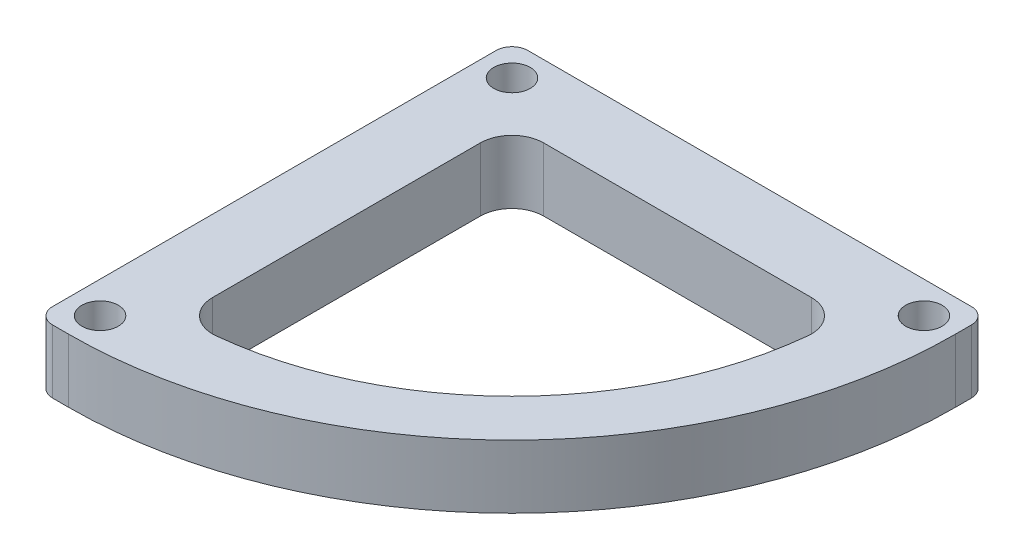
ISO-10303-21;
HEADER;
FILE_DESCRIPTION(('STEP AP214'),'2;1');
FILE_NAME('part.step','',(''),(''),'','','');
FILE_SCHEMA(('AUTOMOTIVE_DESIGN { 1 0 10303 214 1 1 1 1 }'));
ENDSEC;
DATA;
#1=APPLICATION_CONTEXT('core data for automotive mechanical design processes');
#2=APPLICATION_PROTOCOL_DEFINITION('international standard','automotive_design',2000,#1);
#3=PRODUCT_CONTEXT('',#1,'mechanical');
#4=PRODUCT('Part','Part','',(#3));
#5=PRODUCT_RELATED_PRODUCT_CATEGORY('part','',(#4));
#6=PRODUCT_DEFINITION_FORMATION('','',#4);
#7=PRODUCT_DEFINITION_CONTEXT('part definition',#1,'design');
#8=PRODUCT_DEFINITION('design','',#6,#7);
#9=PRODUCT_DEFINITION_SHAPE('','',#8);
#10=(LENGTH_UNIT() NAMED_UNIT(*) SI_UNIT(.MILLI.,.METRE.));
#11=(NAMED_UNIT(*) PLANE_ANGLE_UNIT() SI_UNIT($,.RADIAN.));
#12=(NAMED_UNIT(*) SI_UNIT($,.STERADIAN.) SOLID_ANGLE_UNIT());
#13=UNCERTAINTY_MEASURE_WITH_UNIT(LENGTH_MEASURE(1.E-05),#10,'distance_accuracy_value','');
#14=(GEOMETRIC_REPRESENTATION_CONTEXT(3) GLOBAL_UNCERTAINTY_ASSIGNED_CONTEXT((#13)) GLOBAL_UNIT_ASSIGNED_CONTEXT((#10,
#11,#12)) REPRESENTATION_CONTEXT('',''));
#15=CARTESIAN_POINT('',(0.,0.,0.));
#16=DIRECTION('',(0.,0.,1.));
#17=DIRECTION('',(1.,0.,0.));
#18=AXIS2_PLACEMENT_3D('',#15,#16,#17);
#19=CARTESIAN_POINT('',(0.,4.,0.));
#20=DIRECTION('',(0.,1.,0.));
#21=DIRECTION('',(0.,0.,1.));
#22=AXIS2_PLACEMENT_3D('',#19,#20,#21);
#23=PLANE('',#22);
#24=CARTESIAN_POINT('',(-13.,4.,13.));
#25=DIRECTION('',(0.,1.,0.));
#26=DIRECTION('',(0.,0.,1.));
#27=AXIS2_PLACEMENT_3D('',#24,#25,#26);
#28=CIRCLE('',#27,1.15);
#29=CARTESIAN_POINT('',(-13.,4.,14.15));
#30=VERTEX_POINT('',#29);
#31=EDGE_CURVE('E197',#30,#30,#28,.T.);
#32=ORIENTED_EDGE('',*,*,#31,.F.);
#33=EDGE_LOOP('',(#32));
#34=FACE_BOUND('',#33,.T.);
#35=CARTESIAN_POINT('',(13.,4.,-13.));
#36=DIRECTION('',(0.,1.,0.));
#37=DIRECTION('',(0.,0.,1.));
#38=AXIS2_PLACEMENT_3D('',#35,#36,#37);
#39=CIRCLE('',#38,1.15);
#40=CARTESIAN_POINT('',(13.,4.,-11.85));
#41=VERTEX_POINT('',#40);
#42=EDGE_CURVE('E203',#41,#41,#39,.T.);
#43=ORIENTED_EDGE('',*,*,#42,.F.);
#44=EDGE_LOOP('',(#43));
#45=FACE_BOUND('',#44,.T.);
#46=DIRECTION('',(-1.,0.,0.));
#47=VECTOR('',#46,1.);
#48=CARTESIAN_POINT('',(-15.,4.,-15.));
#49=LINE('',#48,#47);
#50=CARTESIAN_POINT('',(14.,4.,-15.));
#51=VERTEX_POINT('',#50);
#52=CARTESIAN_POINT('',(-14.,4.,-15.));
#53=VERTEX_POINT('',#52);
#54=EDGE_CURVE('E212',#51,#53,#49,.T.);
#55=ORIENTED_EDGE('',*,*,#54,.T.);
#56=CARTESIAN_POINT('',(-14.,4.,-14.));
#57=DIRECTION('',(0.,1.,0.));
#58=DIRECTION('',(0.,0.,1.));
#59=AXIS2_PLACEMENT_3D('',#56,#57,#58);
#60=CIRCLE('',#59,1.);
#61=CARTESIAN_POINT('',(-15.,4.,-14.));
#62=VERTEX_POINT('',#61);
#63=EDGE_CURVE('E261',#53,#62,#60,.T.);
#64=ORIENTED_EDGE('',*,*,#63,.T.);
#65=DIRECTION('',(0.,0.,1.));
#66=VECTOR('',#65,1.);
#67=CARTESIAN_POINT('',(-15.,4.,-15.));
#68=LINE('',#67,#66);
#69=CARTESIAN_POINT('',(-15.,4.,14.));
#70=VERTEX_POINT('',#69);
#71=EDGE_CURVE('E216',#62,#70,#68,.T.);
#72=ORIENTED_EDGE('',*,*,#71,.T.);
#73=CARTESIAN_POINT('',(-14.,4.,14.));
#74=DIRECTION('',(0.,1.,0.));
#75=DIRECTION('',(0.,0.,1.));
#76=AXIS2_PLACEMENT_3D('',#73,#74,#75);
#77=CIRCLE('',#76,1.);
#78=CARTESIAN_POINT('',(-14.,4.,15.));
#79=VERTEX_POINT('',#78);
#80=EDGE_CURVE('E257',#70,#79,#77,.T.);
#81=ORIENTED_EDGE('',*,*,#80,.T.);
#82=DIRECTION('',(1.,0.,0.));
#83=VECTOR('',#82,1.);
#84=CARTESIAN_POINT('',(-15.,4.,15.));
#85=LINE('',#84,#83);
#86=CARTESIAN_POINT('',(-13.,4.,15.));
#87=VERTEX_POINT('',#86);
#88=EDGE_CURVE('E219',#79,#87,#85,.T.);
#89=ORIENTED_EDGE('',*,*,#88,.T.);
#90=CARTESIAN_POINT('',(-13.,4.,-13.));
#91=DIRECTION('',(0.,1.,0.));
#92=DIRECTION('',(0.,0.,1.));
#93=AXIS2_PLACEMENT_3D('',#90,#91,#92);
#94=CIRCLE('',#93,28.);
#95=CARTESIAN_POINT('',(15.,4.,-13.));
#96=VERTEX_POINT('',#95);
#97=EDGE_CURVE('E239',#87,#96,#94,.T.);
#98=ORIENTED_EDGE('',*,*,#97,.T.);
#99=DIRECTION('',(0.,0.,-1.));
#100=VECTOR('',#99,1.);
#101=CARTESIAN_POINT('',(15.,4.,-15.));
#102=LINE('',#101,#100);
#103=CARTESIAN_POINT('',(15.,4.,-14.));
#104=VERTEX_POINT('',#103);
#105=EDGE_CURVE('E209',#96,#104,#102,.T.);
#106=ORIENTED_EDGE('',*,*,#105,.T.);
#107=CARTESIAN_POINT('',(14.,4.,-14.));
#108=DIRECTION('',(0.,1.,0.));
#109=DIRECTION('',(0.,0.,1.));
#110=AXIS2_PLACEMENT_3D('',#107,#108,#109);
#111=CIRCLE('',#110,1.);
#112=EDGE_CURVE('E259',#104,#51,#111,.T.);
#113=ORIENTED_EDGE('',*,*,#112,.T.);
#114=EDGE_LOOP('',(#55,#64,#72,#81,#89,#98,#106,#113));
#115=FACE_BOUND('',#114,.T.);
#116=CARTESIAN_POINT('',(-13.,4.,-13.));
#117=DIRECTION('',(0.,1.,0.));
#118=DIRECTION('',(0.,0.,-1.));
#119=AXIS2_PLACEMENT_3D('',#116,#117,#118);
#120=CIRCLE('',#119,1.15);
#121=CARTESIAN_POINT('',(-13.,4.,-14.15));
#122=VERTEX_POINT('',#121);
#123=EDGE_CURVE('E191',#122,#122,#120,.T.);
#124=ORIENTED_EDGE('',*,*,#123,.F.);
#125=EDGE_LOOP('',(#124));
#126=FACE_BOUND('',#125,.T.);
#127=DIRECTION('',(0.,0.,-1.));
#128=VECTOR('',#127,1.);
#129=CARTESIAN_POINT('',(-10.4472218138456,4.,0.));
#130=LINE('',#129,#128);
#131=CARTESIAN_POINT('',(-10.4472218138456,4.,8.44722181384558));
#132=VERTEX_POINT('',#131);
#133=CARTESIAN_POINT('',(-10.4472218138456,4.,-8.44722181384558));
#134=VERTEX_POINT('',#133);
#135=EDGE_CURVE('E187',#132,#134,#130,.T.);
#136=ORIENTED_EDGE('',*,*,#135,.T.);
#137=CARTESIAN_POINT('',(-8.44722181384559,4.,-8.44722181384559));
#138=DIRECTION('',(0.,1.,0.));
#139=DIRECTION('',(0.,0.,1.));
#140=AXIS2_PLACEMENT_3D('',#137,#138,#139);
#141=CIRCLE('',#140,2.);
#142=CARTESIAN_POINT('',(-8.44722181384559,4.,-10.4472218138456));
#143=VERTEX_POINT('',#142);
#144=EDGE_CURVE('E140',#134,#143,#141,.F.);
#145=ORIENTED_EDGE('',*,*,#144,.T.);
#146=DIRECTION('',(1.,0.,0.));
#147=VECTOR('',#146,1.);
#148=CARTESIAN_POINT('',(0.,4.,-10.4472218138456));
#149=LINE('',#148,#147);
#150=CARTESIAN_POINT('',(8.44722181384559,4.,-10.4472218138456));
#151=VERTEX_POINT('',#150);
#152=EDGE_CURVE('E143',#143,#151,#149,.T.);
#153=ORIENTED_EDGE('',*,*,#152,.T.);
#154=CARTESIAN_POINT('',(8.44722181384559,4.,-8.44722181384559));
#155=DIRECTION('',(0.,1.,0.));
#156=DIRECTION('',(0.,0.,1.));
#157=AXIS2_PLACEMENT_3D('',#154,#155,#156);
#158=CIRCLE('',#157,2.00000000000001);
#159=CARTESIAN_POINT('',(10.4361106167605,4.,-8.23669549805611));
#160=VERTEX_POINT('',#159);
#161=EDGE_CURVE('E178',#151,#160,#158,.F.);
#162=ORIENTED_EDGE('',*,*,#161,.T.);
#163=CARTESIAN_POINT('',(-10.4472218138457,4.,-10.4472218138457));
#164=DIRECTION('',(0.,1.,0.));
#165=DIRECTION('',(0.,0.,1.));
#166=AXIS2_PLACEMENT_3D('',#163,#164,#165);
#167=CIRCLE('',#166,21.0000000000001);
#168=CARTESIAN_POINT('',(-8.2366954980561,4.,10.4361106167605));
#169=VERTEX_POINT('',#168);
#170=EDGE_CURVE('E181',#160,#169,#167,.F.);
#171=ORIENTED_EDGE('',*,*,#170,.T.);
#172=CARTESIAN_POINT('',(-8.44722181384559,4.,8.44722181384559));
#173=DIRECTION('',(0.,1.,0.));
#174=DIRECTION('',(0.,0.,1.));
#175=AXIS2_PLACEMENT_3D('',#172,#173,#174);
#176=CIRCLE('',#175,2.);
#177=EDGE_CURVE('E184',#169,#132,#176,.F.);
#178=ORIENTED_EDGE('',*,*,#177,.T.);
#179=EDGE_LOOP('',(#136,#145,#153,#162,#171,#178));
#180=FACE_BOUND('',#179,.T.);
#181=ADVANCED_FACE('F36',(#34,#45,#115,#126,#180),#23,.T.);
#182=CARTESIAN_POINT('',(0.,0.,0.));
#183=DIRECTION('',(0.,1.,0.));
#184=DIRECTION('',(0.,0.,1.));
#185=AXIS2_PLACEMENT_3D('',#182,#183,#184);
#186=PLANE('',#185);
#187=CARTESIAN_POINT('',(-13.,0.,-13.));
#188=DIRECTION('',(0.,1.,0.));
#189=DIRECTION('',(0.,0.,-1.));
#190=AXIS2_PLACEMENT_3D('',#187,#188,#189);
#191=CIRCLE('',#190,1.15);
#192=CARTESIAN_POINT('',(-13.,0.,-14.15));
#193=VERTEX_POINT('',#192);
#194=EDGE_CURVE('E190',#193,#193,#191,.T.);
#195=ORIENTED_EDGE('',*,*,#194,.T.);
#196=EDGE_LOOP('',(#195));
#197=FACE_BOUND('',#196,.T.);
#198=CARTESIAN_POINT('',(-13.,0.,13.));
#199=DIRECTION('',(0.,1.,0.));
#200=DIRECTION('',(0.,0.,1.));
#201=AXIS2_PLACEMENT_3D('',#198,#199,#200);
#202=CIRCLE('',#201,1.15);
#203=CARTESIAN_POINT('',(-13.,0.,14.15));
#204=VERTEX_POINT('',#203);
#205=EDGE_CURVE('E194',#204,#204,#202,.T.);
#206=ORIENTED_EDGE('',*,*,#205,.T.);
#207=EDGE_LOOP('',(#206));
#208=FACE_BOUND('',#207,.T.);
#209=CARTESIAN_POINT('',(13.,0.,-13.));
#210=DIRECTION('',(0.,1.,0.));
#211=DIRECTION('',(0.,0.,1.));
#212=AXIS2_PLACEMENT_3D('',#209,#210,#211);
#213=CIRCLE('',#212,1.15);
#214=CARTESIAN_POINT('',(13.,0.,-11.85));
#215=VERTEX_POINT('',#214);
#216=EDGE_CURVE('E200',#215,#215,#213,.T.);
#217=ORIENTED_EDGE('',*,*,#216,.T.);
#218=EDGE_LOOP('',(#217));
#219=FACE_BOUND('',#218,.T.);
#220=DIRECTION('',(0.,0.,1.));
#221=VECTOR('',#220,1.);
#222=CARTESIAN_POINT('',(-15.,0.,-15.));
#223=LINE('',#222,#221);
#224=CARTESIAN_POINT('',(-15.,0.,-14.));
#225=VERTEX_POINT('',#224);
#226=CARTESIAN_POINT('',(-15.,0.,14.));
#227=VERTEX_POINT('',#226);
#228=EDGE_CURVE('E227',#225,#227,#223,.T.);
#229=ORIENTED_EDGE('',*,*,#228,.F.);
#230=CARTESIAN_POINT('',(-14.,0.,-14.));
#231=DIRECTION('',(0.,1.,0.));
#232=DIRECTION('',(0.,0.,1.));
#233=AXIS2_PLACEMENT_3D('',#230,#231,#232);
#234=CIRCLE('',#233,1.);
#235=CARTESIAN_POINT('',(-14.,0.,-15.));
#236=VERTEX_POINT('',#235);
#237=EDGE_CURVE('E250',#225,#236,#234,.F.);
#238=ORIENTED_EDGE('',*,*,#237,.T.);
#239=DIRECTION('',(-1.,0.,0.));
#240=VECTOR('',#239,1.);
#241=CARTESIAN_POINT('',(-15.,0.,-15.));
#242=LINE('',#241,#240);
#243=CARTESIAN_POINT('',(14.,0.,-15.));
#244=VERTEX_POINT('',#243);
#245=EDGE_CURVE('E224',#244,#236,#242,.T.);
#246=ORIENTED_EDGE('',*,*,#245,.F.);
#247=CARTESIAN_POINT('',(14.,0.,-14.));
#248=DIRECTION('',(0.,1.,0.));
#249=DIRECTION('',(0.,0.,1.));
#250=AXIS2_PLACEMENT_3D('',#247,#248,#249);
#251=CIRCLE('',#250,1.);
#252=CARTESIAN_POINT('',(15.,0.,-14.));
#253=VERTEX_POINT('',#252);
#254=EDGE_CURVE('E248',#244,#253,#251,.F.);
#255=ORIENTED_EDGE('',*,*,#254,.T.);
#256=DIRECTION('',(0.,0.,-1.));
#257=VECTOR('',#256,1.);
#258=CARTESIAN_POINT('',(15.,0.,-15.));
#259=LINE('',#258,#257);
#260=CARTESIAN_POINT('',(15.,0.,-13.));
#261=VERTEX_POINT('',#260);
#262=EDGE_CURVE('E206',#261,#253,#259,.T.);
#263=ORIENTED_EDGE('',*,*,#262,.F.);
#264=CARTESIAN_POINT('',(-13.,0.,-13.));
#265=DIRECTION('',(0.,1.,0.));
#266=DIRECTION('',(0.,0.,1.));
#267=AXIS2_PLACEMENT_3D('',#264,#265,#266);
#268=CIRCLE('',#267,28.);
#269=CARTESIAN_POINT('',(-13.,0.,15.));
#270=VERTEX_POINT('',#269);
#271=EDGE_CURVE('E233',#261,#270,#268,.F.);
#272=ORIENTED_EDGE('',*,*,#271,.T.);
#273=DIRECTION('',(1.,0.,0.));
#274=VECTOR('',#273,1.);
#275=CARTESIAN_POINT('',(-15.,0.,15.));
#276=LINE('',#275,#274);
#277=CARTESIAN_POINT('',(-14.,0.,15.));
#278=VERTEX_POINT('',#277);
#279=EDGE_CURVE('E213',#278,#270,#276,.T.);
#280=ORIENTED_EDGE('',*,*,#279,.F.);
#281=CARTESIAN_POINT('',(-14.,0.,14.));
#282=DIRECTION('',(0.,1.,0.));
#283=DIRECTION('',(0.,0.,1.));
#284=AXIS2_PLACEMENT_3D('',#281,#282,#283);
#285=CIRCLE('',#284,1.);
#286=EDGE_CURVE('E246',#278,#227,#285,.F.);
#287=ORIENTED_EDGE('',*,*,#286,.T.);
#288=EDGE_LOOP('',(#229,#238,#246,#255,#263,#272,#280,#287));
#289=FACE_BOUND('',#288,.T.);
#290=CARTESIAN_POINT('',(-8.44722181384559,0.,-8.44722181384559));
#291=DIRECTION('',(0.,1.,0.));
#292=DIRECTION('',(0.,0.,1.));
#293=AXIS2_PLACEMENT_3D('',#290,#291,#292);
#294=CIRCLE('',#293,2.);
#295=CARTESIAN_POINT('',(-8.44722181384559,0.,-10.4472218138456));
#296=VERTEX_POINT('',#295);
#297=CARTESIAN_POINT('',(-10.4472218138456,0.,-8.44722181384558));
#298=VERTEX_POINT('',#297);
#299=EDGE_CURVE('E59',#296,#298,#294,.T.);
#300=ORIENTED_EDGE('',*,*,#299,.T.);
#301=DIRECTION('',(0.,0.,1.));
#302=VECTOR('',#301,1.);
#303=CARTESIAN_POINT('',(-10.4472218138456,0.,8.44722181384558));
#304=LINE('',#303,#302);
#305=CARTESIAN_POINT('',(-10.4472218138456,0.,8.44722181384558));
#306=VERTEX_POINT('',#305);
#307=EDGE_CURVE('E147',#298,#306,#304,.T.);
#308=ORIENTED_EDGE('',*,*,#307,.T.);
#309=CARTESIAN_POINT('',(-8.44722181384559,0.,8.44722181384559));
#310=DIRECTION('',(0.,1.,0.));
#311=DIRECTION('',(0.,0.,-1.));
#312=AXIS2_PLACEMENT_3D('',#309,#310,#311);
#313=CIRCLE('',#312,2.);
#314=CARTESIAN_POINT('',(-8.2366954980561,0.,10.4361106167605));
#315=VERTEX_POINT('',#314);
#316=EDGE_CURVE('E153',#306,#315,#313,.T.);
#317=ORIENTED_EDGE('',*,*,#316,.T.);
#318=CARTESIAN_POINT('',(-10.4472218138457,0.,-10.4472218138457));
#319=DIRECTION('',(0.,1.,0.));
#320=DIRECTION('',(0.,0.,-1.));
#321=AXIS2_PLACEMENT_3D('',#318,#319,#320);
#322=CIRCLE('',#321,21.0000000000001);
#323=CARTESIAN_POINT('',(10.4361106167605,0.,-8.23669549805611));
#324=VERTEX_POINT('',#323);
#325=EDGE_CURVE('E162',#315,#324,#322,.T.);
#326=ORIENTED_EDGE('',*,*,#325,.T.);
#327=CARTESIAN_POINT('',(8.44722181384559,0.,-8.44722181384559));
#328=DIRECTION('',(0.,1.,0.));
#329=DIRECTION('',(0.,0.,1.));
#330=AXIS2_PLACEMENT_3D('',#327,#328,#329);
#331=CIRCLE('',#330,2.00000000000001);
#332=CARTESIAN_POINT('',(8.44722181384559,0.,-10.4472218138456));
#333=VERTEX_POINT('',#332);
#334=EDGE_CURVE('E165',#324,#333,#331,.T.);
#335=ORIENTED_EDGE('',*,*,#334,.T.);
#336=DIRECTION('',(-1.,0.,0.));
#337=VECTOR('',#336,1.);
#338=CARTESIAN_POINT('',(8.44722181384559,0.,-10.4472218138456));
#339=LINE('',#338,#337);
#340=EDGE_CURVE('E158',#333,#296,#339,.T.);
#341=ORIENTED_EDGE('',*,*,#340,.T.);
#342=EDGE_LOOP('',(#300,#308,#317,#326,#335,#341));
#343=FACE_BOUND('',#342,.T.);
#344=ADVANCED_FACE('F156',(#197,#208,#219,#289,#343),#186,.F.);
#345=CARTESIAN_POINT('',(15.,4.,-15.));
#346=DIRECTION('',(-1.,0.,0.));
#347=DIRECTION('',(0.,0.,1.));
#348=AXIS2_PLACEMENT_3D('',#345,#346,#347);
#349=PLANE('',#348);
#350=ORIENTED_EDGE('',*,*,#262,.T.);
#351=DIRECTION('',(0.,-1.,0.));
#352=VECTOR('',#351,1.);
#353=CARTESIAN_POINT('',(15.,4.,-14.));
#354=LINE('',#353,#352);
#355=EDGE_CURVE('E44',#253,#104,#354,.F.);
#356=ORIENTED_EDGE('',*,*,#355,.T.);
#357=ORIENTED_EDGE('',*,*,#105,.F.);
#358=DIRECTION('',(0.,-1.,0.));
#359=VECTOR('',#358,1.);
#360=CARTESIAN_POINT('',(15.,4.,-13.));
#361=LINE('',#360,#359);
#362=EDGE_CURVE('E221',#96,#261,#361,.T.);
#363=ORIENTED_EDGE('',*,*,#362,.T.);
#364=EDGE_LOOP('',(#350,#356,#357,#363));
#365=FACE_BOUND('',#364,.T.);
#366=ADVANCED_FACE('F265',(#365),#349,.F.);
#367=CARTESIAN_POINT('',(-15.,4.,-15.));
#368=DIRECTION('',(0.,0.,1.));
#369=DIRECTION('',(1.,0.,0.));
#370=AXIS2_PLACEMENT_3D('',#367,#368,#369);
#371=PLANE('',#370);
#372=ORIENTED_EDGE('',*,*,#245,.T.);
#373=DIRECTION('',(0.,-1.,0.));
#374=VECTOR('',#373,1.);
#375=CARTESIAN_POINT('',(-14.,4.,-15.));
#376=LINE('',#375,#374);
#377=EDGE_CURVE('E255',#236,#53,#376,.F.);
#378=ORIENTED_EDGE('',*,*,#377,.T.);
#379=ORIENTED_EDGE('',*,*,#54,.F.);
#380=DIRECTION('',(0.,-1.,0.));
#381=VECTOR('',#380,1.);
#382=CARTESIAN_POINT('',(14.,4.,-15.));
#383=LINE('',#382,#381);
#384=EDGE_CURVE('E252',#51,#244,#383,.T.);
#385=ORIENTED_EDGE('',*,*,#384,.T.);
#386=EDGE_LOOP('',(#372,#378,#379,#385));
#387=FACE_BOUND('',#386,.T.);
#388=ADVANCED_FACE('F278',(#387),#371,.F.);
#389=CARTESIAN_POINT('',(-15.,4.,-15.));
#390=DIRECTION('',(1.,0.,0.));
#391=DIRECTION('',(0.,0.,-1.));
#392=AXIS2_PLACEMENT_3D('',#389,#390,#391);
#393=PLANE('',#392);
#394=ORIENTED_EDGE('',*,*,#71,.F.);
#395=DIRECTION('',(0.,-1.,0.));
#396=VECTOR('',#395,1.);
#397=CARTESIAN_POINT('',(-15.,4.,-14.));
#398=LINE('',#397,#396);
#399=EDGE_CURVE('E243',#62,#225,#398,.T.);
#400=ORIENTED_EDGE('',*,*,#399,.T.);
#401=ORIENTED_EDGE('',*,*,#228,.T.);
#402=DIRECTION('',(0.,-1.,0.));
#403=VECTOR('',#402,1.);
#404=CARTESIAN_POINT('',(-15.,4.,14.));
#405=LINE('',#404,#403);
#406=EDGE_CURVE('E241',#227,#70,#405,.F.);
#407=ORIENTED_EDGE('',*,*,#406,.T.);
#408=EDGE_LOOP('',(#394,#400,#401,#407));
#409=FACE_BOUND('',#408,.T.);
#410=ADVANCED_FACE('F288',(#409),#393,.F.);
#411=CARTESIAN_POINT('',(-15.,4.,15.));
#412=DIRECTION('',(0.,0.,-1.));
#413=DIRECTION('',(-1.,0.,0.));
#414=AXIS2_PLACEMENT_3D('',#411,#412,#413);
#415=PLANE('',#414);
#416=ORIENTED_EDGE('',*,*,#88,.F.);
#417=DIRECTION('',(0.,-1.,0.));
#418=VECTOR('',#417,1.);
#419=CARTESIAN_POINT('',(-14.,4.,15.));
#420=LINE('',#419,#418);
#421=EDGE_CURVE('E11',#79,#278,#420,.T.);
#422=ORIENTED_EDGE('',*,*,#421,.T.);
#423=ORIENTED_EDGE('',*,*,#279,.T.);
#424=DIRECTION('',(0.,-1.,0.));
#425=VECTOR('',#424,1.);
#426=CARTESIAN_POINT('',(-13.,4.,15.));
#427=LINE('',#426,#425);
#428=EDGE_CURVE('E236',#270,#87,#427,.F.);
#429=ORIENTED_EDGE('',*,*,#428,.T.);
#430=EDGE_LOOP('',(#416,#422,#423,#429));
#431=FACE_BOUND('',#430,.T.);
#432=ADVANCED_FACE('F296',(#431),#415,.F.);
#433=CARTESIAN_POINT('',(13.,4.,-13.));
#434=DIRECTION('',(0.,-1.,0.));
#435=DIRECTION('',(0.,0.,-1.));
#436=AXIS2_PLACEMENT_3D('',#433,#434,#435);
#437=CYLINDRICAL_SURFACE('',#436,1.15);
#438=ORIENTED_EDGE('',*,*,#42,.T.);
#439=EDGE_LOOP('',(#438));
#440=FACE_BOUND('',#439,.T.);
#441=ORIENTED_EDGE('',*,*,#216,.F.);
#442=EDGE_LOOP('',(#441));
#443=FACE_BOUND('',#442,.T.);
#444=ADVANCED_FACE('F323',(#440,#443),#437,.F.);
#445=CARTESIAN_POINT('',(-13.,4.,13.));
#446=DIRECTION('',(0.,-1.,0.));
#447=DIRECTION('',(0.,0.,-1.));
#448=AXIS2_PLACEMENT_3D('',#445,#446,#447);
#449=CYLINDRICAL_SURFACE('',#448,1.15);
#450=ORIENTED_EDGE('',*,*,#31,.T.);
#451=EDGE_LOOP('',(#450));
#452=FACE_BOUND('',#451,.T.);
#453=ORIENTED_EDGE('',*,*,#205,.F.);
#454=EDGE_LOOP('',(#453));
#455=FACE_BOUND('',#454,.T.);
#456=ADVANCED_FACE('F308',(#452,#455),#449,.F.);
#457=CARTESIAN_POINT('',(-13.,4.,-13.));
#458=DIRECTION('',(0.,-1.,0.));
#459=DIRECTION('',(0.,0.,-1.));
#460=AXIS2_PLACEMENT_3D('',#457,#458,#459);
#461=CYLINDRICAL_SURFACE('',#460,1.15);
#462=ORIENTED_EDGE('',*,*,#123,.T.);
#463=EDGE_LOOP('',(#462));
#464=FACE_BOUND('',#463,.T.);
#465=ORIENTED_EDGE('',*,*,#194,.F.);
#466=EDGE_LOOP('',(#465));
#467=FACE_BOUND('',#466,.T.);
#468=ADVANCED_FACE('F301',(#464,#467),#461,.F.);
#469=CARTESIAN_POINT('',(-13.,4.,-13.));
#470=DIRECTION('',(0.,-1.,0.));
#471=DIRECTION('',(0.,0.,-1.));
#472=AXIS2_PLACEMENT_3D('',#469,#470,#471);
#473=CYLINDRICAL_SURFACE('',#472,28.);
#474=ORIENTED_EDGE('',*,*,#97,.F.);
#475=ORIENTED_EDGE('',*,*,#428,.F.);
#476=ORIENTED_EDGE('',*,*,#271,.F.);
#477=ORIENTED_EDGE('',*,*,#362,.F.);
#478=EDGE_LOOP('',(#474,#475,#476,#477));
#479=FACE_BOUND('',#478,.T.);
#480=ADVANCED_FACE('F299',(#479),#473,.T.);
#481=CARTESIAN_POINT('',(-14.,4.,-14.));
#482=DIRECTION('',(0.,-1.,0.));
#483=DIRECTION('',(0.,0.,-1.));
#484=AXIS2_PLACEMENT_3D('',#481,#482,#483);
#485=CYLINDRICAL_SURFACE('',#484,1.);
#486=ORIENTED_EDGE('',*,*,#63,.F.);
#487=ORIENTED_EDGE('',*,*,#377,.F.);
#488=ORIENTED_EDGE('',*,*,#237,.F.);
#489=ORIENTED_EDGE('',*,*,#399,.F.);
#490=EDGE_LOOP('',(#486,#487,#488,#489));
#491=FACE_BOUND('',#490,.T.);
#492=ADVANCED_FACE('F285',(#491),#485,.T.);
#493=CARTESIAN_POINT('',(14.,4.,-14.));
#494=DIRECTION('',(0.,-1.,0.));
#495=DIRECTION('',(0.,0.,-1.));
#496=AXIS2_PLACEMENT_3D('',#493,#494,#495);
#497=CYLINDRICAL_SURFACE('',#496,1.);
#498=ORIENTED_EDGE('',*,*,#112,.F.);
#499=ORIENTED_EDGE('',*,*,#355,.F.);
#500=ORIENTED_EDGE('',*,*,#254,.F.);
#501=ORIENTED_EDGE('',*,*,#384,.F.);
#502=EDGE_LOOP('',(#498,#499,#500,#501));
#503=FACE_BOUND('',#502,.T.);
#504=ADVANCED_FACE('F275',(#503),#497,.T.);
#505=CARTESIAN_POINT('',(-14.,4.,14.));
#506=DIRECTION('',(0.,-1.,0.));
#507=DIRECTION('',(0.,0.,-1.));
#508=AXIS2_PLACEMENT_3D('',#505,#506,#507);
#509=CYLINDRICAL_SURFACE('',#508,1.);
#510=ORIENTED_EDGE('',*,*,#80,.F.);
#511=ORIENTED_EDGE('',*,*,#406,.F.);
#512=ORIENTED_EDGE('',*,*,#286,.F.);
#513=ORIENTED_EDGE('',*,*,#421,.F.);
#514=EDGE_LOOP('',(#510,#511,#512,#513));
#515=FACE_BOUND('',#514,.T.);
#516=ADVANCED_FACE('F38',(#515),#509,.T.);
#517=CARTESIAN_POINT('',(-8.44722181384559,22.,-8.44722181384559));
#518=DIRECTION('',(0.,-1.,0.));
#519=DIRECTION('',(0.,0.,-1.));
#520=AXIS2_PLACEMENT_3D('',#517,#518,#519);
#521=CYLINDRICAL_SURFACE('',#520,2.);
#522=DIRECTION('',(0.,-1.,0.));
#523=VECTOR('',#522,1.);
#524=CARTESIAN_POINT('',(-10.4472218138456,22.,-8.44722181384558));
#525=LINE('',#524,#523);
#526=EDGE_CURVE('E136',#134,#298,#525,.T.);
#527=ORIENTED_EDGE('',*,*,#526,.T.);
#528=ORIENTED_EDGE('',*,*,#299,.F.);
#529=DIRECTION('',(0.,-1.,0.));
#530=VECTOR('',#529,1.);
#531=CARTESIAN_POINT('',(-8.44722181384559,22.,-10.4472218138456));
#532=LINE('',#531,#530);
#533=EDGE_CURVE('E168',#143,#296,#532,.T.);
#534=ORIENTED_EDGE('',*,*,#533,.F.);
#535=ORIENTED_EDGE('',*,*,#144,.F.);
#536=EDGE_LOOP('',(#527,#528,#534,#535));
#537=FACE_BOUND('',#536,.T.);
#538=ADVANCED_FACE('F138',(#537),#521,.F.);
#539=CARTESIAN_POINT('',(-10.4472218138456,22.,8.44722181384558));
#540=DIRECTION('',(1.,0.,0.));
#541=DIRECTION('',(0.,0.,-1.));
#542=AXIS2_PLACEMENT_3D('',#539,#540,#541);
#543=PLANE('',#542);
#544=DIRECTION('',(0.,-1.,0.));
#545=VECTOR('',#544,1.);
#546=CARTESIAN_POINT('',(-10.4472218138456,22.,8.44722181384558));
#547=LINE('',#546,#545);
#548=EDGE_CURVE('E144',#132,#306,#547,.T.);
#549=ORIENTED_EDGE('',*,*,#548,.T.);
#550=ORIENTED_EDGE('',*,*,#307,.F.);
#551=ORIENTED_EDGE('',*,*,#526,.F.);
#552=ORIENTED_EDGE('',*,*,#135,.F.);
#553=EDGE_LOOP('',(#549,#550,#551,#552));
#554=FACE_BOUND('',#553,.T.);
#555=ADVANCED_FACE('F148',(#554),#543,.T.);
#556=CARTESIAN_POINT('',(-8.44722181384559,22.,8.44722181384559));
#557=DIRECTION('',(0.,-1.,0.));
#558=DIRECTION('',(0.,0.,-1.));
#559=AXIS2_PLACEMENT_3D('',#556,#557,#558);
#560=CYLINDRICAL_SURFACE('',#559,2.);
#561=DIRECTION('',(0.,-1.,0.));
#562=VECTOR('',#561,1.);
#563=CARTESIAN_POINT('',(-8.2366954980561,22.,10.4361106167605));
#564=LINE('',#563,#562);
#565=EDGE_CURVE('E173',#169,#315,#564,.T.);
#566=ORIENTED_EDGE('',*,*,#565,.T.);
#567=ORIENTED_EDGE('',*,*,#316,.F.);
#568=ORIENTED_EDGE('',*,*,#548,.F.);
#569=ORIENTED_EDGE('',*,*,#177,.F.);
#570=EDGE_LOOP('',(#566,#567,#568,#569));
#571=FACE_BOUND('',#570,.T.);
#572=ADVANCED_FACE('F410',(#571),#560,.F.);
#573=CARTESIAN_POINT('',(-10.4472218138457,22.,-10.4472218138457));
#574=DIRECTION('',(0.,-1.,0.));
#575=DIRECTION('',(0.,0.,-1.));
#576=AXIS2_PLACEMENT_3D('',#573,#574,#575);
#577=CYLINDRICAL_SURFACE('',#576,21.0000000000001);
#578=DIRECTION('',(0.,-1.,0.));
#579=VECTOR('',#578,1.);
#580=CARTESIAN_POINT('',(10.4361106167605,22.,-8.23669549805611));
#581=LINE('',#580,#579);
#582=EDGE_CURVE('E171',#160,#324,#581,.T.);
#583=ORIENTED_EDGE('',*,*,#582,.T.);
#584=ORIENTED_EDGE('',*,*,#325,.F.);
#585=ORIENTED_EDGE('',*,*,#565,.F.);
#586=ORIENTED_EDGE('',*,*,#170,.F.);
#587=EDGE_LOOP('',(#583,#584,#585,#586));
#588=FACE_BOUND('',#587,.T.);
#589=ADVANCED_FACE('F418',(#588),#577,.F.);
#590=CARTESIAN_POINT('',(8.44722181384559,22.,-8.44722181384559));
#591=DIRECTION('',(0.,-1.,0.));
#592=DIRECTION('',(0.,0.,-1.));
#593=AXIS2_PLACEMENT_3D('',#590,#591,#592);
#594=CYLINDRICAL_SURFACE('',#593,2.00000000000001);
#595=DIRECTION('',(0.,-1.,0.));
#596=VECTOR('',#595,1.);
#597=CARTESIAN_POINT('',(8.44722181384559,22.,-10.4472218138456));
#598=LINE('',#597,#596);
#599=EDGE_CURVE('E51',#151,#333,#598,.T.);
#600=ORIENTED_EDGE('',*,*,#599,.T.);
#601=ORIENTED_EDGE('',*,*,#334,.F.);
#602=ORIENTED_EDGE('',*,*,#582,.F.);
#603=ORIENTED_EDGE('',*,*,#161,.F.);
#604=EDGE_LOOP('',(#600,#601,#602,#603));
#605=FACE_BOUND('',#604,.T.);
#606=ADVANCED_FACE('F427',(#605),#594,.F.);
#607=CARTESIAN_POINT('',(8.44722181384559,22.,-10.4472218138456));
#608=DIRECTION('',(0.,0.,1.));
#609=DIRECTION('',(1.,0.,0.));
#610=AXIS2_PLACEMENT_3D('',#607,#608,#609);
#611=PLANE('',#610);
#612=ORIENTED_EDGE('',*,*,#533,.T.);
#613=ORIENTED_EDGE('',*,*,#340,.F.);
#614=ORIENTED_EDGE('',*,*,#599,.F.);
#615=ORIENTED_EDGE('',*,*,#152,.F.);
#616=EDGE_LOOP('',(#612,#613,#614,#615));
#617=FACE_BOUND('',#616,.T.);
#618=ADVANCED_FACE('F436',(#617),#611,.T.);
#619=CLOSED_SHELL('',(#181,#344,#366,#388,#410,#432,#444,#456,#468,#480,#492,#504,#516,#538,
#555,#572,#589,#606,#618));
#620=MANIFOLD_SOLID_BREP('B2',#619);
#621=ADVANCED_BREP_SHAPE_REPRESENTATION('',(#18,#620),#14);
#622=SHAPE_DEFINITION_REPRESENTATION(#9,#621);
ENDSEC;
END-ISO-10303-21;
